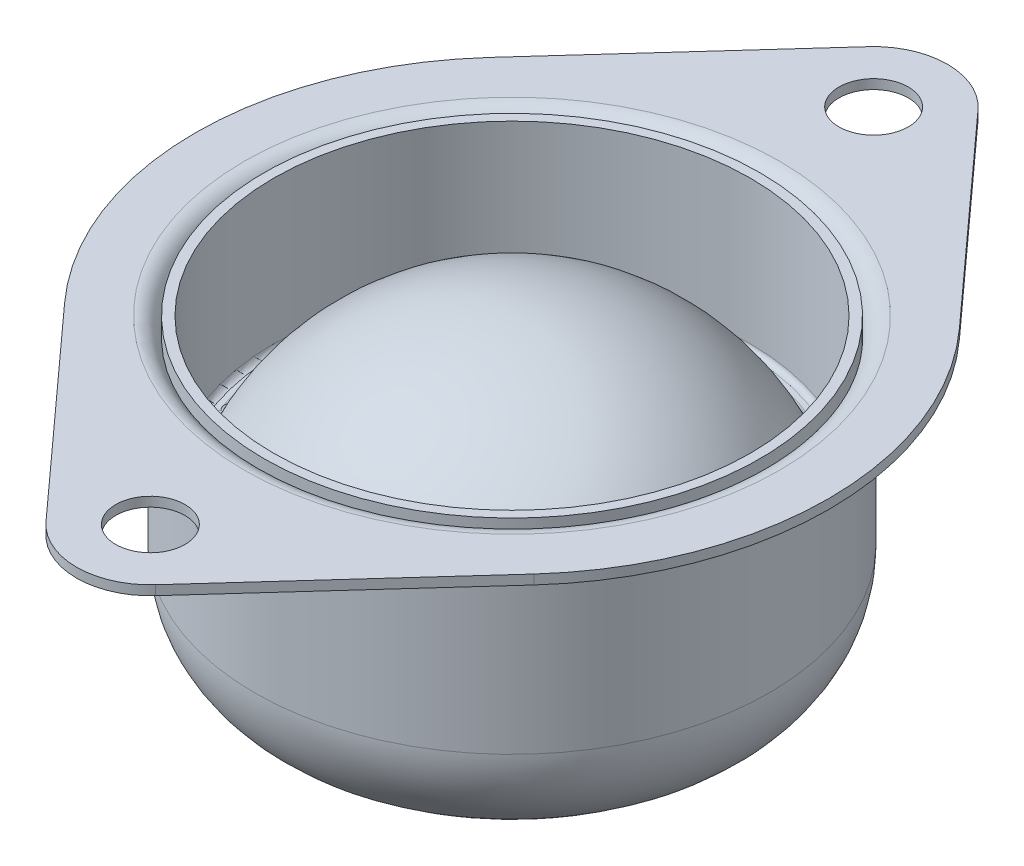
ISO-10303-21;
HEADER;
FILE_DESCRIPTION(('STEP AP214'),'2;1');
FILE_NAME('part.step','',(''),(''),'','','');
FILE_SCHEMA(('AUTOMOTIVE_DESIGN { 1 0 10303 214 1 1 1 1 }'));
ENDSEC;
DATA;
#1=APPLICATION_CONTEXT('core data for automotive mechanical design processes');
#2=APPLICATION_PROTOCOL_DEFINITION('international standard','automotive_design',2000,#1);
#3=PRODUCT_CONTEXT('',#1,'mechanical');
#4=PRODUCT('Part','Part','',(#3));
#5=PRODUCT_RELATED_PRODUCT_CATEGORY('part','',(#4));
#6=PRODUCT_DEFINITION_FORMATION('','',#4);
#7=PRODUCT_DEFINITION_CONTEXT('part definition',#1,'design');
#8=PRODUCT_DEFINITION('design','',#6,#7);
#9=PRODUCT_DEFINITION_SHAPE('','',#8);
#10=(LENGTH_UNIT() NAMED_UNIT(*) SI_UNIT(.MILLI.,.METRE.));
#11=(NAMED_UNIT(*) PLANE_ANGLE_UNIT() SI_UNIT($,.RADIAN.));
#12=(NAMED_UNIT(*) SI_UNIT($,.STERADIAN.) SOLID_ANGLE_UNIT());
#13=UNCERTAINTY_MEASURE_WITH_UNIT(LENGTH_MEASURE(1.E-05),#10,'distance_accuracy_value','');
#14=(GEOMETRIC_REPRESENTATION_CONTEXT(3) GLOBAL_UNCERTAINTY_ASSIGNED_CONTEXT((#13)) GLOBAL_UNIT_ASSIGNED_CONTEXT((#10,
#11,#12)) REPRESENTATION_CONTEXT('',''));
#15=CARTESIAN_POINT('',(0.,0.,0.));
#16=DIRECTION('',(0.,0.,1.));
#17=DIRECTION('',(1.,0.,0.));
#18=AXIS2_PLACEMENT_3D('',#15,#16,#17);
#19=CARTESIAN_POINT('',(0.,-16.7005,0.));
#20=DIRECTION('',(0.,-1.,0.));
#21=DIRECTION('',(0.,0.,1.));
#22=AXIS2_PLACEMENT_3D('',#19,#20,#21);
#23=SPHERICAL_SURFACE('',#22,12.7);
#24=CARTESIAN_POINT('',(0.,-29.4005,0.));
#25=VERTEX_POINT('',#24);
#26=VERTEX_LOOP('',#25);
#27=FACE_BOUND('',#26,.T.);
#28=ADVANCED_FACE('F46',(#27),#23,.T.);
#29=CLOSED_SHELL('',(#28));
#30=MANIFOLD_SOLID_BREP('B2',#29);
#31=CARTESIAN_POINT('',(0.,-11.938,0.));
#32=DIRECTION('',(0.,1.,0.));
#33=DIRECTION('',(0.,0.,1.));
#34=AXIS2_PLACEMENT_3D('',#31,#32,#33);
#35=CYLINDRICAL_SURFACE('',#34,19.8755);
#36=CARTESIAN_POINT('',(0.,-10.747375,0.));
#37=DIRECTION('',(0.,1.,0.));
#38=DIRECTION('',(0.,0.,1.));
#39=AXIS2_PLACEMENT_3D('',#36,#37,#38);
#40=CIRCLE('',#39,19.8755);
#41=CARTESIAN_POINT('',(0.,-10.747375,19.8755));
#42=VERTEX_POINT('',#41);
#43=EDGE_CURVE('E84',#42,#42,#40,.T.);
#44=ORIENTED_EDGE('',*,*,#43,.T.);
#45=EDGE_LOOP('',(#44));
#46=FACE_BOUND('',#45,.T.);
#47=CARTESIAN_POINT('',(0.,0.762,0.));
#48=DIRECTION('',(0.,1.,0.));
#49=DIRECTION('',(0.,0.,1.));
#50=AXIS2_PLACEMENT_3D('',#47,#48,#49);
#51=CIRCLE('',#50,19.8755);
#52=CARTESIAN_POINT('',(0.,0.762,19.8755));
#53=VERTEX_POINT('',#52);
#54=EDGE_CURVE('E89',#53,#53,#51,.T.);
#55=ORIENTED_EDGE('',*,*,#54,.F.);
#56=EDGE_LOOP('',(#55));
#57=FACE_BOUND('',#56,.T.);
#58=ADVANCED_FACE('F69',(#46,#57),#35,.T.);
#59=CARTESIAN_POINT('',(0.,-11.938,0.));
#60=DIRECTION('',(0.,1.,0.));
#61=DIRECTION('',(0.,0.,1.));
#62=AXIS2_PLACEMENT_3D('',#59,#60,#61);
#63=PLANE('',#62);
#64=CARTESIAN_POINT('',(0.,-11.938,0.));
#65=DIRECTION('',(0.,1.,0.));
#66=DIRECTION('',(0.,0.,1.));
#67=AXIS2_PLACEMENT_3D('',#64,#65,#66);
#68=CIRCLE('',#67,18.684875);
#69=CARTESIAN_POINT('',(0.,-11.938,18.684875));
#70=VERTEX_POINT('',#69);
#71=EDGE_CURVE('E76',#70,#70,#68,.F.);
#72=ORIENTED_EDGE('',*,*,#71,.T.);
#73=EDGE_LOOP('',(#72));
#74=FACE_BOUND('',#73,.T.);
#75=CARTESIAN_POINT('',(0.,-11.938,0.));
#76=DIRECTION('',(0.,1.,0.));
#77=DIRECTION('',(0.,0.,1.));
#78=AXIS2_PLACEMENT_3D('',#75,#76,#77);
#79=CIRCLE('',#78,18.2583205347589);
#80=CARTESIAN_POINT('',(0.,-11.938,18.2583205347589));
#81=VERTEX_POINT('',#80);
#82=EDGE_CURVE('E80',#81,#81,#79,.T.);
#83=ORIENTED_EDGE('',*,*,#82,.T.);
#84=EDGE_LOOP('',(#83));
#85=FACE_BOUND('',#84,.T.);
#86=ADVANCED_FACE('F121',(#74,#85),#63,.F.);
#87=CARTESIAN_POINT('',(0.,0.762,0.));
#88=DIRECTION('',(0.,1.,0.));
#89=DIRECTION('',(0.,0.,1.));
#90=AXIS2_PLACEMENT_3D('',#87,#88,#89);
#91=PLANE('',#90);
#92=CARTESIAN_POINT('',(0.,0.762000000000001,0.));
#93=DIRECTION('',(0.,1.,0.));
#94=DIRECTION('',(0.,0.,1.));
#95=AXIS2_PLACEMENT_3D('',#92,#93,#94);
#96=CIRCLE('',#95,19.1135);
#97=CARTESIAN_POINT('',(0.,0.762000000000001,19.1135));
#98=VERTEX_POINT('',#97);
#99=EDGE_CURVE('E93',#98,#98,#96,.T.);
#100=ORIENTED_EDGE('',*,*,#99,.F.);
#101=EDGE_LOOP('',(#100));
#102=FACE_BOUND('',#101,.T.);
#103=ORIENTED_EDGE('',*,*,#54,.T.);
#104=EDGE_LOOP('',(#103));
#105=FACE_BOUND('',#104,.T.);
#106=ADVANCED_FACE('F117',(#102,#105),#91,.T.);
#107=CARTESIAN_POINT('',(0.,-18.7407752659574,0.));
#108=DIRECTION('',(0.,-1.,0.));
#109=DIRECTION('',(0.,0.,1.));
#110=AXIS2_PLACEMENT_3D('',#107,#108,#109);
#111=SPHERICAL_SURFACE('',#110,18.7407752659574);
#112=CARTESIAN_POINT('',(0.,-11.2248699107771,0.));
#113=DIRECTION('',(0.,-1.,0.));
#114=DIRECTION('',(0.,0.,-1.));
#115=AXIS2_PLACEMENT_3D('',#112,#113,#114);
#116=CIRCLE('',#115,17.1676388668067);
#117=CARTESIAN_POINT('',(0.,-11.2248699107771,-17.1676388668067));
#118=VERTEX_POINT('',#117);
#119=EDGE_CURVE('E45',#118,#118,#116,.T.);
#120=ORIENTED_EDGE('',*,*,#119,.T.);
#121=EDGE_LOOP('',(#120));
#122=FACE_BOUND('',#121,.T.);
#123=ADVANCED_FACE('F120',(#122),#111,.F.);
#124=CARTESIAN_POINT('',(0.,-10.747375,0.));
#125=DIRECTION('',(0.,1.,0.));
#126=DIRECTION('',(0.,0.,1.));
#127=AXIS2_PLACEMENT_3D('',#124,#125,#126);
#128=TOROIDAL_SURFACE('',#127,18.684875,1.190625);
#129=ORIENTED_EDGE('',*,*,#71,.F.);
#130=EDGE_LOOP('',(#129));
#131=FACE_BOUND('',#130,.T.);
#132=ORIENTED_EDGE('',*,*,#43,.F.);
#133=EDGE_LOOP('',(#132));
#134=FACE_BOUND('',#133,.T.);
#135=ADVANCED_FACE('F132',(#131,#134),#128,.T.);
#136=CARTESIAN_POINT('',(0.,-10.747375,0.));
#137=DIRECTION('',(0.,1.,0.));
#138=DIRECTION('',(0.,0.,1.));
#139=AXIS2_PLACEMENT_3D('',#136,#137,#138);
#140=TOROIDAL_SURFACE('',#139,18.2583205347589,1.190625);
#141=ORIENTED_EDGE('',*,*,#82,.F.);
#142=EDGE_LOOP('',(#141));
#143=FACE_BOUND('',#142,.T.);
#144=ORIENTED_EDGE('',*,*,#119,.F.);
#145=EDGE_LOOP('',(#144));
#146=FACE_BOUND('',#145,.T.);
#147=ADVANCED_FACE('F71',(#143,#146),#140,.T.);
#148=CARTESIAN_POINT('',(0.,-11.938,0.));
#149=DIRECTION('',(0.,1.,0.));
#150=DIRECTION('',(0.,0.,1.));
#151=AXIS2_PLACEMENT_3D('',#148,#149,#150);
#152=CYLINDRICAL_SURFACE('',#151,19.1135);
#153=CARTESIAN_POINT('',(0.,-10.747375,0.));
#154=DIRECTION('',(0.,1.,0.));
#155=DIRECTION('',(0.,0.,1.));
#156=AXIS2_PLACEMENT_3D('',#153,#154,#155);
#157=CIRCLE('',#156,19.1135);
#158=CARTESIAN_POINT('',(0.,-10.747375,19.1135));
#159=VERTEX_POINT('',#158);
#160=EDGE_CURVE('E96',#159,#159,#157,.T.);
#161=ORIENTED_EDGE('',*,*,#160,.F.);
#162=EDGE_LOOP('',(#161));
#163=FACE_BOUND('',#162,.T.);
#164=ORIENTED_EDGE('',*,*,#99,.T.);
#165=EDGE_LOOP('',(#164));
#166=FACE_BOUND('',#165,.T.);
#167=ADVANCED_FACE('F110',(#163,#166),#152,.F.);
#168=CARTESIAN_POINT('',(0.,-11.176,0.));
#169=DIRECTION('',(0.,1.,0.));
#170=DIRECTION('',(0.,0.,1.));
#171=AXIS2_PLACEMENT_3D('',#168,#169,#170);
#172=PLANE('',#171);
#173=CARTESIAN_POINT('',(0.,-11.176,0.));
#174=DIRECTION('',(0.,1.,0.));
#175=DIRECTION('',(0.,0.,1.));
#176=AXIS2_PLACEMENT_3D('',#173,#174,#175);
#177=CIRCLE('',#176,18.684875);
#178=CARTESIAN_POINT('',(0.,-11.176,18.684875));
#179=VERTEX_POINT('',#178);
#180=EDGE_CURVE('E99',#179,#179,#177,.F.);
#181=ORIENTED_EDGE('',*,*,#180,.F.);
#182=EDGE_LOOP('',(#181));
#183=FACE_BOUND('',#182,.T.);
#184=CARTESIAN_POINT('',(0.,-11.176,0.));
#185=DIRECTION('',(0.,1.,0.));
#186=DIRECTION('',(0.,0.,1.));
#187=AXIS2_PLACEMENT_3D('',#184,#185,#186);
#188=CIRCLE('',#187,18.2583205347589);
#189=CARTESIAN_POINT('',(0.,-11.176,18.2583205347589));
#190=VERTEX_POINT('',#189);
#191=EDGE_CURVE('E100',#190,#190,#188,.T.);
#192=ORIENTED_EDGE('',*,*,#191,.F.);
#193=EDGE_LOOP('',(#192));
#194=FACE_BOUND('',#193,.T.);
#195=ADVANCED_FACE('F113',(#183,#194),#172,.T.);
#196=CARTESIAN_POINT('',(0.,-18.7407752659574,0.));
#197=DIRECTION('',(0.,-1.,0.));
#198=DIRECTION('',(0.,0.,1.));
#199=AXIS2_PLACEMENT_3D('',#196,#197,#198);
#200=SPHERICAL_SURFACE('',#199,19.5027752659574);
#201=CARTESIAN_POINT('',(0.,-10.9192731678797,0.));
#202=DIRECTION('',(0.,-1.,0.));
#203=DIRECTION('',(0.,0.,-1.));
#204=AXIS2_PLACEMENT_3D('',#201,#202,#203);
#205=CIRCLE('',#204,17.8656751342961);
#206=CARTESIAN_POINT('',(0.,-10.9192731678797,-17.8656751342961));
#207=VERTEX_POINT('',#206);
#208=EDGE_CURVE('E92',#207,#207,#205,.T.);
#209=ORIENTED_EDGE('',*,*,#208,.F.);
#210=EDGE_LOOP('',(#209));
#211=FACE_BOUND('',#210,.T.);
#212=ADVANCED_FACE('F152',(#211),#200,.T.);
#213=CARTESIAN_POINT('',(0.,-10.747375,0.));
#214=DIRECTION('',(0.,1.,0.));
#215=DIRECTION('',(0.,0.,1.));
#216=AXIS2_PLACEMENT_3D('',#213,#214,#215);
#217=TOROIDAL_SURFACE('',#216,18.684875,0.428625);
#218=ORIENTED_EDGE('',*,*,#180,.T.);
#219=EDGE_LOOP('',(#218));
#220=FACE_BOUND('',#219,.T.);
#221=ORIENTED_EDGE('',*,*,#160,.T.);
#222=EDGE_LOOP('',(#221));
#223=FACE_BOUND('',#222,.T.);
#224=ADVANCED_FACE('F108',(#220,#223),#217,.F.);
#225=CARTESIAN_POINT('',(0.,-10.747375,0.));
#226=DIRECTION('',(0.,1.,0.));
#227=DIRECTION('',(0.,0.,1.));
#228=AXIS2_PLACEMENT_3D('',#225,#226,#227);
#229=TOROIDAL_SURFACE('',#228,18.2583205347589,0.428625);
#230=ORIENTED_EDGE('',*,*,#191,.T.);
#231=EDGE_LOOP('',(#230));
#232=FACE_BOUND('',#231,.T.);
#233=ORIENTED_EDGE('',*,*,#208,.T.);
#234=EDGE_LOOP('',(#233));
#235=FACE_BOUND('',#234,.T.);
#236=ADVANCED_FACE('F146',(#232,#235),#229,.F.);
#237=CLOSED_SHELL('',(#58,#86,#106,#123,#135,#147,#167,#195,#212,#224,#236));
#238=MANIFOLD_SOLID_BREP('B6',#237);
#239=CARTESIAN_POINT('',(0.,0.762,0.));
#240=DIRECTION('',(0.,1.,0.));
#241=DIRECTION('',(0.,0.,1.));
#242=AXIS2_PLACEMENT_3D('',#239,#240,#241);
#243=PLANE('',#242);
#244=CARTESIAN_POINT('',(0.,0.762,0.));
#245=DIRECTION('',(0.,1.,0.));
#246=DIRECTION('',(0.,0.,1.));
#247=AXIS2_PLACEMENT_3D('',#244,#245,#246);
#248=CIRCLE('',#247,21.463);
#249=CARTESIAN_POINT('',(0.,0.762,21.463));
#250=VERTEX_POINT('',#249);
#251=EDGE_CURVE('E240',#250,#250,#248,.F.);
#252=ORIENTED_EDGE('',*,*,#251,.T.);
#253=EDGE_LOOP('',(#252));
#254=FACE_BOUND('',#253,.T.);
#255=CARTESIAN_POINT('',(0.,0.762,-29.));
#256=DIRECTION('',(0.,1.,0.));
#257=DIRECTION('',(0.,0.,1.));
#258=AXIS2_PLACEMENT_3D('',#255,#256,#257);
#259=CIRCLE('',#258,2.778125);
#260=CARTESIAN_POINT('',(0.,0.762,-31.778125));
#261=VERTEX_POINT('',#260);
#262=EDGE_CURVE('E333',#261,#261,#259,.T.);
#263=ORIENTED_EDGE('',*,*,#262,.F.);
#264=EDGE_LOOP('',(#263));
#265=FACE_BOUND('',#264,.T.);
#266=CARTESIAN_POINT('',(0.,0.762,0.));
#267=DIRECTION('',(0.,1.,0.));
#268=DIRECTION('',(0.,0.,1.));
#269=AXIS2_PLACEMENT_3D('',#266,#267,#268);
#270=CIRCLE('',#269,25.4);
#271=CARTESIAN_POINT('',(18.8203250421146,0.762,17.0574137931034));
#272=VERTEX_POINT('',#271);
#273=CARTESIAN_POINT('',(18.8203250421146,0.762,-17.0574137931035));
#274=VERTEX_POINT('',#273);
#275=EDGE_CURVE('E344',#272,#274,#270,.T.);
#276=ORIENTED_EDGE('',*,*,#275,.T.);
#277=DIRECTION('',(-0.671551724137932,0.,-0.740957678823407));
#278=VECTOR('',#277,1.);
#279=CARTESIAN_POINT('',(18.8203250421146,0.762,-17.0574137931035));
#280=LINE('',#279,#278);
#281=CARTESIAN_POINT('',(4.39017424702869,0.762,-32.9789439655172));
#282=VERTEX_POINT('',#281);
#283=EDGE_CURVE('E292',#274,#282,#280,.T.);
#284=ORIENTED_EDGE('',*,*,#283,.T.);
#285=CARTESIAN_POINT('',(0.,0.762,-29.));
#286=DIRECTION('',(0.,1.,0.));
#287=DIRECTION('',(0.,0.,1.));
#288=AXIS2_PLACEMENT_3D('',#285,#286,#287);
#289=CIRCLE('',#288,5.92499999999999);
#290=CARTESIAN_POINT('',(-4.39017424702868,0.762,-32.9789439655172));
#291=VERTEX_POINT('',#290);
#292=EDGE_CURVE('E464',#282,#291,#289,.T.);
#293=ORIENTED_EDGE('',*,*,#292,.T.);
#294=DIRECTION('',(-0.671551724137931,0.,0.740957678823408));
#295=VECTOR('',#294,1.);
#296=CARTESIAN_POINT('',(-4.39017424702868,0.762,-32.9789439655172));
#297=LINE('',#296,#295);
#298=CARTESIAN_POINT('',(-18.8203250421145,0.762,-17.0574137931034));
#299=VERTEX_POINT('',#298);
#300=EDGE_CURVE('E466',#291,#299,#297,.T.);
#301=ORIENTED_EDGE('',*,*,#300,.T.);
#302=CARTESIAN_POINT('',(0.,0.762,0.));
#303=DIRECTION('',(0.,1.,0.));
#304=DIRECTION('',(0.,0.,1.));
#305=AXIS2_PLACEMENT_3D('',#302,#303,#304);
#306=CIRCLE('',#305,25.4);
#307=CARTESIAN_POINT('',(-18.8203250421145,0.762,17.0574137931034));
#308=VERTEX_POINT('',#307);
#309=EDGE_CURVE('E311',#299,#308,#306,.T.);
#310=ORIENTED_EDGE('',*,*,#309,.T.);
#311=DIRECTION('',(0.671551724137931,0.,0.740957678823408));
#312=VECTOR('',#311,1.);
#313=CARTESIAN_POINT('',(-4.39017424702868,0.762,32.9789439655172));
#314=LINE('',#313,#312);
#315=CARTESIAN_POINT('',(-4.39017424702868,0.762,32.9789439655172));
#316=VERTEX_POINT('',#315);
#317=EDGE_CURVE('E305',#308,#316,#314,.T.);
#318=ORIENTED_EDGE('',*,*,#317,.T.);
#319=CARTESIAN_POINT('',(0.,0.762,29.));
#320=DIRECTION('',(0.,1.,0.));
#321=DIRECTION('',(0.,0.,1.));
#322=AXIS2_PLACEMENT_3D('',#319,#320,#321);
#323=CIRCLE('',#322,5.92499999999999);
#324=CARTESIAN_POINT('',(4.39017424702869,0.762,32.9789439655172));
#325=VERTEX_POINT('',#324);
#326=EDGE_CURVE('E309',#316,#325,#323,.T.);
#327=ORIENTED_EDGE('',*,*,#326,.T.);
#328=DIRECTION('',(0.671551724137931,0.,-0.740957678823407));
#329=VECTOR('',#328,1.);
#330=CARTESIAN_POINT('',(18.8203250421146,0.762,17.0574137931034));
#331=LINE('',#330,#329);
#332=EDGE_CURVE('E248',#325,#272,#331,.T.);
#333=ORIENTED_EDGE('',*,*,#332,.T.);
#334=EDGE_LOOP('',(#276,#284,#293,#301,#310,#318,#327,#333));
#335=FACE_BOUND('',#334,.T.);
#336=CARTESIAN_POINT('',(0.,0.762,29.));
#337=DIRECTION('',(0.,1.,0.));
#338=DIRECTION('',(0.,0.,1.));
#339=AXIS2_PLACEMENT_3D('',#336,#337,#338);
#340=CIRCLE('',#339,2.778125);
#341=CARTESIAN_POINT('',(0.,0.762,26.221875));
#342=VERTEX_POINT('',#341);
#343=EDGE_CURVE('E452',#342,#342,#340,.T.);
#344=ORIENTED_EDGE('',*,*,#343,.F.);
#345=EDGE_LOOP('',(#344));
#346=FACE_BOUND('',#345,.T.);
#347=ADVANCED_FACE('F231',(#254,#265,#335,#346),#243,.T.);
#348=CARTESIAN_POINT('',(0.,0.,0.));
#349=DIRECTION('',(0.,1.,0.));
#350=DIRECTION('',(0.,0.,1.));
#351=AXIS2_PLACEMENT_3D('',#348,#349,#350);
#352=PLANE('',#351);
#353=CARTESIAN_POINT('',(0.,0.,0.));
#354=DIRECTION('',(0.,1.,0.));
#355=DIRECTION('',(0.,0.,1.));
#356=AXIS2_PLACEMENT_3D('',#353,#354,#355);
#357=CIRCLE('',#356,22.225);
#358=CARTESIAN_POINT('',(0.,0.,22.225));
#359=VERTEX_POINT('',#358);
#360=EDGE_CURVE('E365',#359,#359,#357,.T.);
#361=ORIENTED_EDGE('',*,*,#360,.T.);
#362=EDGE_LOOP('',(#361));
#363=FACE_BOUND('',#362,.T.);
#364=CARTESIAN_POINT('',(0.,0.,0.));
#365=DIRECTION('',(0.,1.,0.));
#366=DIRECTION('',(0.,0.,1.));
#367=AXIS2_PLACEMENT_3D('',#364,#365,#366);
#368=CIRCLE('',#367,25.4);
#369=CARTESIAN_POINT('',(18.8203250421146,0.,17.0574137931034));
#370=VERTEX_POINT('',#369);
#371=CARTESIAN_POINT('',(18.8203250421146,0.,-17.0574137931035));
#372=VERTEX_POINT('',#371);
#373=EDGE_CURVE('E329',#370,#372,#368,.T.);
#374=ORIENTED_EDGE('',*,*,#373,.F.);
#375=DIRECTION('',(0.671551724137931,0.,-0.740957678823407));
#376=VECTOR('',#375,1.);
#377=CARTESIAN_POINT('',(18.8203250421146,0.,17.0574137931034));
#378=LINE('',#377,#376);
#379=CARTESIAN_POINT('',(4.39017424702869,0.,32.9789439655172));
#380=VERTEX_POINT('',#379);
#381=EDGE_CURVE('E283',#380,#370,#378,.T.);
#382=ORIENTED_EDGE('',*,*,#381,.F.);
#383=CARTESIAN_POINT('',(0.,0.,29.));
#384=DIRECTION('',(0.,1.,0.));
#385=DIRECTION('',(0.,0.,1.));
#386=AXIS2_PLACEMENT_3D('',#383,#384,#385);
#387=CIRCLE('',#386,5.92499999999999);
#388=CARTESIAN_POINT('',(-4.39017424702868,0.,32.9789439655172));
#389=VERTEX_POINT('',#388);
#390=EDGE_CURVE('E277',#389,#380,#387,.T.);
#391=ORIENTED_EDGE('',*,*,#390,.F.);
#392=DIRECTION('',(0.671551724137931,0.,0.740957678823408));
#393=VECTOR('',#392,1.);
#394=CARTESIAN_POINT('',(-4.39017424702868,0.,32.9789439655172));
#395=LINE('',#394,#393);
#396=CARTESIAN_POINT('',(-18.8203250421145,0.,17.0574137931034));
#397=VERTEX_POINT('',#396);
#398=EDGE_CURVE('E319',#397,#389,#395,.T.);
#399=ORIENTED_EDGE('',*,*,#398,.F.);
#400=CARTESIAN_POINT('',(0.,0.,0.));
#401=DIRECTION('',(0.,1.,0.));
#402=DIRECTION('',(0.,0.,1.));
#403=AXIS2_PLACEMENT_3D('',#400,#401,#402);
#404=CIRCLE('',#403,25.4);
#405=CARTESIAN_POINT('',(-18.8203250421145,0.,-17.0574137931034));
#406=VERTEX_POINT('',#405);
#407=EDGE_CURVE('E339',#406,#397,#404,.T.);
#408=ORIENTED_EDGE('',*,*,#407,.F.);
#409=DIRECTION('',(-0.671551724137931,0.,0.740957678823408));
#410=VECTOR('',#409,1.);
#411=CARTESIAN_POINT('',(-4.39017424702868,0.,-32.9789439655172));
#412=LINE('',#411,#410);
#413=CARTESIAN_POINT('',(-4.39017424702868,0.,-32.9789439655172));
#414=VERTEX_POINT('',#413);
#415=EDGE_CURVE('E337',#414,#406,#412,.T.);
#416=ORIENTED_EDGE('',*,*,#415,.F.);
#417=CARTESIAN_POINT('',(0.,0.,-29.));
#418=DIRECTION('',(0.,1.,0.));
#419=DIRECTION('',(0.,0.,1.));
#420=AXIS2_PLACEMENT_3D('',#417,#418,#419);
#421=CIRCLE('',#420,5.92499999999999);
#422=CARTESIAN_POINT('',(4.39017424702869,0.,-32.9789439655172));
#423=VERTEX_POINT('',#422);
#424=EDGE_CURVE('E335',#423,#414,#421,.T.);
#425=ORIENTED_EDGE('',*,*,#424,.F.);
#426=DIRECTION('',(-0.671551724137932,0.,-0.740957678823407));
#427=VECTOR('',#426,1.);
#428=CARTESIAN_POINT('',(18.8203250421146,0.,-17.0574137931035));
#429=LINE('',#428,#427);
#430=EDGE_CURVE('E332',#372,#423,#429,.T.);
#431=ORIENTED_EDGE('',*,*,#430,.F.);
#432=EDGE_LOOP('',(#374,#382,#391,#399,#408,#416,#425,#431));
#433=FACE_BOUND('',#432,.T.);
#434=CARTESIAN_POINT('',(0.,0.,-29.));
#435=DIRECTION('',(0.,1.,0.));
#436=DIRECTION('',(0.,0.,1.));
#437=AXIS2_PLACEMENT_3D('',#434,#435,#436);
#438=CIRCLE('',#437,2.778125);
#439=CARTESIAN_POINT('',(0.,0.,-31.778125));
#440=VERTEX_POINT('',#439);
#441=EDGE_CURVE('E455',#440,#440,#438,.T.);
#442=ORIENTED_EDGE('',*,*,#441,.T.);
#443=EDGE_LOOP('',(#442));
#444=FACE_BOUND('',#443,.T.);
#445=CARTESIAN_POINT('',(0.,0.,29.));
#446=DIRECTION('',(0.,1.,0.));
#447=DIRECTION('',(0.,0.,1.));
#448=AXIS2_PLACEMENT_3D('',#445,#446,#447);
#449=CIRCLE('',#448,2.778125);
#450=CARTESIAN_POINT('',(0.,0.,26.221875));
#451=VERTEX_POINT('',#450);
#452=EDGE_CURVE('E451',#451,#451,#449,.T.);
#453=ORIENTED_EDGE('',*,*,#452,.T.);
#454=EDGE_LOOP('',(#453));
#455=FACE_BOUND('',#454,.T.);
#456=ADVANCED_FACE('F386',(#363,#433,#444,#455),#352,.F.);
#457=CARTESIAN_POINT('',(0.,0.762,0.));
#458=DIRECTION('',(0.,-1.,0.));
#459=DIRECTION('',(0.,0.,-1.));
#460=AXIS2_PLACEMENT_3D('',#457,#458,#459);
#461=CYLINDRICAL_SURFACE('',#460,25.4);
#462=ORIENTED_EDGE('',*,*,#373,.T.);
#463=DIRECTION('',(0.,-1.,0.));
#464=VECTOR('',#463,1.);
#465=CARTESIAN_POINT('',(18.8203250421146,0.762,-17.0574137931035));
#466=LINE('',#465,#464);
#467=EDGE_CURVE('E357',#274,#372,#466,.T.);
#468=ORIENTED_EDGE('',*,*,#467,.F.);
#469=ORIENTED_EDGE('',*,*,#275,.F.);
#470=DIRECTION('',(0.,-1.,0.));
#471=VECTOR('',#470,1.);
#472=CARTESIAN_POINT('',(18.8203250421146,0.762,17.0574137931034));
#473=LINE('',#472,#471);
#474=EDGE_CURVE('E325',#272,#370,#473,.T.);
#475=ORIENTED_EDGE('',*,*,#474,.T.);
#476=EDGE_LOOP('',(#462,#468,#469,#475));
#477=FACE_BOUND('',#476,.T.);
#478=ADVANCED_FACE('F391',(#477),#461,.T.);
#479=CARTESIAN_POINT('',(18.8203250421146,0.762,-17.0574137931035));
#480=DIRECTION('',(-0.740957678823407,0.,0.671551724137931));
#481=DIRECTION('',(0.671551724137932,0.,0.740957678823407));
#482=AXIS2_PLACEMENT_3D('',#479,#480,#481);
#483=PLANE('',#482);
#484=ORIENTED_EDGE('',*,*,#430,.T.);
#485=DIRECTION('',(0.,-1.,0.));
#486=VECTOR('',#485,1.);
#487=CARTESIAN_POINT('',(4.39017424702869,0.762,-32.9789439655172));
#488=LINE('',#487,#486);
#489=EDGE_CURVE('E354',#282,#423,#488,.T.);
#490=ORIENTED_EDGE('',*,*,#489,.F.);
#491=ORIENTED_EDGE('',*,*,#283,.F.);
#492=ORIENTED_EDGE('',*,*,#467,.T.);
#493=EDGE_LOOP('',(#484,#490,#491,#492));
#494=FACE_BOUND('',#493,.T.);
#495=ADVANCED_FACE('F416',(#494),#483,.F.);
#496=CARTESIAN_POINT('',(0.,0.762,-29.));
#497=DIRECTION('',(0.,-1.,0.));
#498=DIRECTION('',(0.,0.,-1.));
#499=AXIS2_PLACEMENT_3D('',#496,#497,#498);
#500=CYLINDRICAL_SURFACE('',#499,5.92499999999999);
#501=ORIENTED_EDGE('',*,*,#424,.T.);
#502=DIRECTION('',(0.,-1.,0.));
#503=VECTOR('',#502,1.);
#504=CARTESIAN_POINT('',(-4.39017424702868,0.762,-32.9789439655172));
#505=LINE('',#504,#503);
#506=EDGE_CURVE('E351',#291,#414,#505,.T.);
#507=ORIENTED_EDGE('',*,*,#506,.F.);
#508=ORIENTED_EDGE('',*,*,#292,.F.);
#509=ORIENTED_EDGE('',*,*,#489,.T.);
#510=EDGE_LOOP('',(#501,#507,#508,#509));
#511=FACE_BOUND('',#510,.T.);
#512=ADVANCED_FACE('F412',(#511),#500,.T.);
#513=CARTESIAN_POINT('',(-4.39017424702868,0.762,-32.9789439655172));
#514=DIRECTION('',(0.740957678823408,0.,0.671551724137931));
#515=DIRECTION('',(0.671551724137931,0.,-0.740957678823408));
#516=AXIS2_PLACEMENT_3D('',#513,#514,#515);
#517=PLANE('',#516);
#518=ORIENTED_EDGE('',*,*,#415,.T.);
#519=DIRECTION('',(0.,-1.,0.));
#520=VECTOR('',#519,1.);
#521=CARTESIAN_POINT('',(-18.8203250421145,0.762,-17.0574137931034));
#522=LINE('',#521,#520);
#523=EDGE_CURVE('E348',#299,#406,#522,.T.);
#524=ORIENTED_EDGE('',*,*,#523,.F.);
#525=ORIENTED_EDGE('',*,*,#300,.F.);
#526=ORIENTED_EDGE('',*,*,#506,.T.);
#527=EDGE_LOOP('',(#518,#524,#525,#526));
#528=FACE_BOUND('',#527,.T.);
#529=ADVANCED_FACE('F408',(#528),#517,.F.);
#530=CARTESIAN_POINT('',(0.,0.762,0.));
#531=DIRECTION('',(0.,-1.,0.));
#532=DIRECTION('',(0.,0.,-1.));
#533=AXIS2_PLACEMENT_3D('',#530,#531,#532);
#534=CYLINDRICAL_SURFACE('',#533,25.4);
#535=ORIENTED_EDGE('',*,*,#407,.T.);
#536=DIRECTION('',(0.,-1.,0.));
#537=VECTOR('',#536,1.);
#538=CARTESIAN_POINT('',(-18.8203250421145,0.762,17.0574137931034));
#539=LINE('',#538,#537);
#540=EDGE_CURVE('E320',#308,#397,#539,.T.);
#541=ORIENTED_EDGE('',*,*,#540,.F.);
#542=ORIENTED_EDGE('',*,*,#309,.F.);
#543=ORIENTED_EDGE('',*,*,#523,.T.);
#544=EDGE_LOOP('',(#535,#541,#542,#543));
#545=FACE_BOUND('',#544,.T.);
#546=ADVANCED_FACE('F405',(#545),#534,.T.);
#547=CARTESIAN_POINT('',(-4.39017424702868,0.762,32.9789439655172));
#548=DIRECTION('',(0.740957678823407,0.,-0.671551724137931));
#549=DIRECTION('',(-0.671551724137931,0.,-0.740957678823408));
#550=AXIS2_PLACEMENT_3D('',#547,#548,#549);
#551=PLANE('',#550);
#552=ORIENTED_EDGE('',*,*,#398,.T.);
#553=DIRECTION('',(0.,-1.,0.));
#554=VECTOR('',#553,1.);
#555=CARTESIAN_POINT('',(-4.39017424702868,0.762,32.9789439655172));
#556=LINE('',#555,#554);
#557=EDGE_CURVE('E316',#316,#389,#556,.T.);
#558=ORIENTED_EDGE('',*,*,#557,.F.);
#559=ORIENTED_EDGE('',*,*,#317,.F.);
#560=ORIENTED_EDGE('',*,*,#540,.T.);
#561=EDGE_LOOP('',(#552,#558,#559,#560));
#562=FACE_BOUND('',#561,.T.);
#563=ADVANCED_FACE('F317',(#562),#551,.F.);
#564=CARTESIAN_POINT('',(0.,0.762,29.));
#565=DIRECTION('',(0.,-1.,0.));
#566=DIRECTION('',(0.,0.,-1.));
#567=AXIS2_PLACEMENT_3D('',#564,#565,#566);
#568=CYLINDRICAL_SURFACE('',#567,5.92499999999999);
#569=ORIENTED_EDGE('',*,*,#390,.T.);
#570=DIRECTION('',(0.,-1.,0.));
#571=VECTOR('',#570,1.);
#572=CARTESIAN_POINT('',(4.39017424702869,0.762,32.9789439655172));
#573=LINE('',#572,#571);
#574=EDGE_CURVE('E321',#325,#380,#573,.T.);
#575=ORIENTED_EDGE('',*,*,#574,.F.);
#576=ORIENTED_EDGE('',*,*,#326,.F.);
#577=ORIENTED_EDGE('',*,*,#557,.T.);
#578=EDGE_LOOP('',(#569,#575,#576,#577));
#579=FACE_BOUND('',#578,.T.);
#580=ADVANCED_FACE('F323',(#579),#568,.T.);
#581=CARTESIAN_POINT('',(18.8203250421146,0.762,17.0574137931034));
#582=DIRECTION('',(-0.740957678823407,0.,-0.671551724137931));
#583=DIRECTION('',(-0.671551724137931,0.,0.740957678823407));
#584=AXIS2_PLACEMENT_3D('',#581,#582,#583);
#585=PLANE('',#584);
#586=ORIENTED_EDGE('',*,*,#381,.T.);
#587=ORIENTED_EDGE('',*,*,#474,.F.);
#588=ORIENTED_EDGE('',*,*,#332,.F.);
#589=ORIENTED_EDGE('',*,*,#574,.T.);
#590=EDGE_LOOP('',(#586,#587,#588,#589));
#591=FACE_BOUND('',#590,.T.);
#592=ADVANCED_FACE('F398',(#591),#585,.F.);
#593=CARTESIAN_POINT('',(0.,0.762,-29.));
#594=DIRECTION('',(0.,-1.,0.));
#595=DIRECTION('',(0.,0.,-1.));
#596=AXIS2_PLACEMENT_3D('',#593,#594,#595);
#597=CYLINDRICAL_SURFACE('',#596,2.778125);
#598=CARTESIAN_POINT('',(0.,0.762,-31.778125));
#599=CARTESIAN_POINT('',(0.,0.7540625,-31.778125));
#600=CARTESIAN_POINT('',(0.,0.746125,-31.778125));
#601=CARTESIAN_POINT('',(0.,0.73025,-31.778125));
#602=CARTESIAN_POINT('',(0.,0.7223125,-31.778125));
#603=CARTESIAN_POINT('',(0.,0.7064375,-31.778125));
#604=CARTESIAN_POINT('',(0.,0.6985,-31.778125));
#605=CARTESIAN_POINT('',(0.,0.682625,-31.778125));
#606=CARTESIAN_POINT('',(0.,0.6746875,-31.778125));
#607=CARTESIAN_POINT('',(0.,0.6588125,-31.778125));
#608=CARTESIAN_POINT('',(0.,0.650875,-31.778125));
#609=CARTESIAN_POINT('',(0.,0.635,-31.778125));
#610=CARTESIAN_POINT('',(0.,0.6270625,-31.778125));
#611=CARTESIAN_POINT('',(0.,0.6111875,-31.778125));
#612=CARTESIAN_POINT('',(0.,0.60325,-31.778125));
#613=CARTESIAN_POINT('',(0.,0.587375,-31.778125));
#614=CARTESIAN_POINT('',(0.,0.5794375,-31.778125));
#615=CARTESIAN_POINT('',(0.,0.5635625,-31.778125));
#616=CARTESIAN_POINT('',(0.,0.555625,-31.778125));
#617=CARTESIAN_POINT('',(0.,0.53975,-31.778125));
#618=CARTESIAN_POINT('',(0.,0.5318125,-31.778125));
#619=CARTESIAN_POINT('',(0.,0.5159375,-31.778125));
#620=CARTESIAN_POINT('',(0.,0.508,-31.778125));
#621=CARTESIAN_POINT('',(0.,0.492125,-31.778125));
#622=CARTESIAN_POINT('',(0.,0.4841875,-31.778125));
#623=CARTESIAN_POINT('',(0.,0.4683125,-31.778125));
#624=CARTESIAN_POINT('',(0.,0.460375,-31.778125));
#625=CARTESIAN_POINT('',(0.,0.4445,-31.778125));
#626=CARTESIAN_POINT('',(0.,0.4365625,-31.778125));
#627=CARTESIAN_POINT('',(0.,0.4206875,-31.778125));
#628=CARTESIAN_POINT('',(0.,0.41275,-31.778125));
#629=CARTESIAN_POINT('',(0.,0.396875,-31.778125));
#630=CARTESIAN_POINT('',(0.,0.3889375,-31.778125));
#631=CARTESIAN_POINT('',(0.,0.3730625,-31.778125));
#632=CARTESIAN_POINT('',(0.,0.365125,-31.778125));
#633=CARTESIAN_POINT('',(0.,0.34925,-31.778125));
#634=CARTESIAN_POINT('',(0.,0.3413125,-31.778125));
#635=CARTESIAN_POINT('',(0.,0.3254375,-31.778125));
#636=CARTESIAN_POINT('',(0.,0.3175,-31.778125));
#637=CARTESIAN_POINT('',(0.,0.301625,-31.778125));
#638=CARTESIAN_POINT('',(0.,0.2936875,-31.778125));
#639=CARTESIAN_POINT('',(0.,0.2778125,-31.778125));
#640=CARTESIAN_POINT('',(0.,0.269875,-31.778125));
#641=CARTESIAN_POINT('',(0.,0.254,-31.778125));
#642=CARTESIAN_POINT('',(0.,0.2460625,-31.778125));
#643=CARTESIAN_POINT('',(0.,0.2301875,-31.778125));
#644=CARTESIAN_POINT('',(0.,0.22225,-31.778125));
#645=CARTESIAN_POINT('',(0.,0.206375,-31.778125));
#646=CARTESIAN_POINT('',(0.,0.1984375,-31.778125));
#647=CARTESIAN_POINT('',(0.,0.1825625,-31.778125));
#648=CARTESIAN_POINT('',(0.,0.174625,-31.778125));
#649=CARTESIAN_POINT('',(0.,0.15875,-31.778125));
#650=CARTESIAN_POINT('',(0.,0.1508125,-31.778125));
#651=CARTESIAN_POINT('',(0.,0.1349375,-31.778125));
#652=CARTESIAN_POINT('',(0.,0.127,-31.778125));
#653=CARTESIAN_POINT('',(0.,0.111125,-31.778125));
#654=CARTESIAN_POINT('',(0.,0.1031875,-31.778125));
#655=CARTESIAN_POINT('',(0.,0.0873125,-31.778125));
#656=CARTESIAN_POINT('',(0.,0.079375,-31.778125));
#657=CARTESIAN_POINT('',(0.,0.0635,-31.778125));
#658=CARTESIAN_POINT('',(0.,0.0555625,-31.778125));
#659=CARTESIAN_POINT('',(0.,0.0396875,-31.778125));
#660=CARTESIAN_POINT('',(0.,0.03175,-31.778125));
#661=CARTESIAN_POINT('',(0.,0.015875,-31.778125));
#662=CARTESIAN_POINT('',(0.,0.00793749999999999,-31.778125));
#663=CARTESIAN_POINT('',(0.,0.,-31.778125));
#664=B_SPLINE_CURVE_WITH_KNOTS('',3,(#598,#599,#600,#601,#602,#603,#604,#605,#606,#607,#608,
#609,#610,#611,#612,#613,#614,#615,#616,#617,#618,#619,#620,#621,#622,#623,#624,#625,#626,#627,
#628,#629,#630,#631,#632,#633,#634,#635,#636,#637,#638,#639,#640,#641,#642,#643,#644,#645,#646,
#647,#648,#649,#650,#651,#652,#653,#654,#655,#656,#657,#658,#659,#660,#661,#662,#663),
.UNSPECIFIED.,.F.,.F.,(4,2,2,2,2,2,2,2,2,2,2,2,2,2,2,2,2,2,2,2,2,2,2,2,2,2,2,2,2,2,2,2,4),(0.,
0.0238125,0.0476249999999999,0.0714374999999999,0.09525,0.1190625,0.142875,0.1666875,0.1905,
0.2143125,0.238125,0.2619375,0.28575,0.3095625,0.333375,0.3571875,0.381,0.4048125,0.428625,
0.4524375,0.47625,0.5000625,0.523875,0.5476875,0.5715,0.5953125,0.619125,0.6429375,0.66675,
0.6905625,0.714375,0.7381875,0.762),.UNSPECIFIED.);
#665=EDGE_CURVE('BSEAM395',#261,#440,#664,.T.);
#666=ORIENTED_EDGE('',*,*,#262,.T.);
#667=ORIENTED_EDGE('',*,*,#441,.F.);
#668=ORIENTED_EDGE('',*,*,#665,.T.);
#669=ORIENTED_EDGE('',*,*,#665,.F.);
#670=EDGE_LOOP('',(#666,#668,#667,#669));
#671=FACE_BOUND('',#670,.T.);
#672=ADVANCED_FACE('F395',(#671),#597,.F.);
#673=CARTESIAN_POINT('',(0.,0.762,29.));
#674=DIRECTION('',(0.,-1.,0.));
#675=DIRECTION('',(0.,0.,-1.));
#676=AXIS2_PLACEMENT_3D('',#673,#674,#675);
#677=CYLINDRICAL_SURFACE('',#676,2.778125);
#678=CARTESIAN_POINT('',(0.,0.762,26.221875));
#679=CARTESIAN_POINT('',(0.,0.7540625,26.221875));
#680=CARTESIAN_POINT('',(0.,0.746125,26.221875));
#681=CARTESIAN_POINT('',(0.,0.73025,26.221875));
#682=CARTESIAN_POINT('',(0.,0.7223125,26.221875));
#683=CARTESIAN_POINT('',(0.,0.7064375,26.221875));
#684=CARTESIAN_POINT('',(0.,0.6985,26.221875));
#685=CARTESIAN_POINT('',(0.,0.682625,26.221875));
#686=CARTESIAN_POINT('',(0.,0.6746875,26.221875));
#687=CARTESIAN_POINT('',(0.,0.6588125,26.221875));
#688=CARTESIAN_POINT('',(0.,0.650875,26.221875));
#689=CARTESIAN_POINT('',(0.,0.635,26.221875));
#690=CARTESIAN_POINT('',(0.,0.6270625,26.221875));
#691=CARTESIAN_POINT('',(0.,0.6111875,26.221875));
#692=CARTESIAN_POINT('',(0.,0.60325,26.221875));
#693=CARTESIAN_POINT('',(0.,0.587375,26.221875));
#694=CARTESIAN_POINT('',(0.,0.5794375,26.221875));
#695=CARTESIAN_POINT('',(0.,0.5635625,26.221875));
#696=CARTESIAN_POINT('',(0.,0.555625,26.221875));
#697=CARTESIAN_POINT('',(0.,0.53975,26.221875));
#698=CARTESIAN_POINT('',(0.,0.5318125,26.221875));
#699=CARTESIAN_POINT('',(0.,0.5159375,26.221875));
#700=CARTESIAN_POINT('',(0.,0.508,26.221875));
#701=CARTESIAN_POINT('',(0.,0.492125,26.221875));
#702=CARTESIAN_POINT('',(0.,0.4841875,26.221875));
#703=CARTESIAN_POINT('',(0.,0.4683125,26.221875));
#704=CARTESIAN_POINT('',(0.,0.460375,26.221875));
#705=CARTESIAN_POINT('',(0.,0.4445,26.221875));
#706=CARTESIAN_POINT('',(0.,0.4365625,26.221875));
#707=CARTESIAN_POINT('',(0.,0.4206875,26.221875));
#708=CARTESIAN_POINT('',(0.,0.41275,26.221875));
#709=CARTESIAN_POINT('',(0.,0.396875,26.221875));
#710=CARTESIAN_POINT('',(0.,0.3889375,26.221875));
#711=CARTESIAN_POINT('',(0.,0.3730625,26.221875));
#712=CARTESIAN_POINT('',(0.,0.365125,26.221875));
#713=CARTESIAN_POINT('',(0.,0.34925,26.221875));
#714=CARTESIAN_POINT('',(0.,0.3413125,26.221875));
#715=CARTESIAN_POINT('',(0.,0.3254375,26.221875));
#716=CARTESIAN_POINT('',(0.,0.3175,26.221875));
#717=CARTESIAN_POINT('',(0.,0.301625,26.221875));
#718=CARTESIAN_POINT('',(0.,0.2936875,26.221875));
#719=CARTESIAN_POINT('',(0.,0.2778125,26.221875));
#720=CARTESIAN_POINT('',(0.,0.269875,26.221875));
#721=CARTESIAN_POINT('',(0.,0.254,26.221875));
#722=CARTESIAN_POINT('',(0.,0.2460625,26.221875));
#723=CARTESIAN_POINT('',(0.,0.2301875,26.221875));
#724=CARTESIAN_POINT('',(0.,0.22225,26.221875));
#725=CARTESIAN_POINT('',(0.,0.206375,26.221875));
#726=CARTESIAN_POINT('',(0.,0.1984375,26.221875));
#727=CARTESIAN_POINT('',(0.,0.1825625,26.221875));
#728=CARTESIAN_POINT('',(0.,0.174625,26.221875));
#729=CARTESIAN_POINT('',(0.,0.15875,26.221875));
#730=CARTESIAN_POINT('',(0.,0.1508125,26.221875));
#731=CARTESIAN_POINT('',(0.,0.1349375,26.221875));
#732=CARTESIAN_POINT('',(0.,0.127,26.221875));
#733=CARTESIAN_POINT('',(0.,0.111125,26.221875));
#734=CARTESIAN_POINT('',(0.,0.1031875,26.221875));
#735=CARTESIAN_POINT('',(0.,0.0873125,26.221875));
#736=CARTESIAN_POINT('',(0.,0.079375,26.221875));
#737=CARTESIAN_POINT('',(0.,0.0635,26.221875));
#738=CARTESIAN_POINT('',(0.,0.0555625,26.221875));
#739=CARTESIAN_POINT('',(0.,0.0396875,26.221875));
#740=CARTESIAN_POINT('',(0.,0.03175,26.221875));
#741=CARTESIAN_POINT('',(0.,0.015875,26.221875));
#742=CARTESIAN_POINT('',(0.,0.00793749999999999,26.221875));
#743=CARTESIAN_POINT('',(0.,0.,26.221875));
#744=B_SPLINE_CURVE_WITH_KNOTS('',3,(#678,#679,#680,#681,#682,#683,#684,#685,#686,#687,#688,
#689,#690,#691,#692,#693,#694,#695,#696,#697,#698,#699,#700,#701,#702,#703,#704,#705,#706,#707,
#708,#709,#710,#711,#712,#713,#714,#715,#716,#717,#718,#719,#720,#721,#722,#723,#724,#725,#726,
#727,#728,#729,#730,#731,#732,#733,#734,#735,#736,#737,#738,#739,#740,#741,#742,#743),
.UNSPECIFIED.,.F.,.F.,(4,2,2,2,2,2,2,2,2,2,2,2,2,2,2,2,2,2,2,2,2,2,2,2,2,2,2,2,2,2,2,2,4),(0.,
0.0238125,0.0476249999999999,0.0714374999999999,0.09525,0.1190625,0.142875,0.1666875,0.1905,
0.2143125,0.238125,0.2619375,0.28575,0.3095625,0.333375,0.3571875,0.381,0.4048125,0.428625,
0.4524375,0.47625,0.5000625,0.523875,0.5476875,0.5715,0.5953125,0.619125,0.6429375,0.66675,
0.6905625,0.714375,0.7381875,0.762),.UNSPECIFIED.);
#745=EDGE_CURVE('BSEAM434',#342,#451,#744,.T.);
#746=ORIENTED_EDGE('',*,*,#343,.T.);
#747=ORIENTED_EDGE('',*,*,#452,.F.);
#748=ORIENTED_EDGE('',*,*,#745,.T.);
#749=ORIENTED_EDGE('',*,*,#745,.F.);
#750=EDGE_LOOP('',(#746,#748,#747,#749));
#751=FACE_BOUND('',#750,.T.);
#752=ADVANCED_FACE('F434',(#751),#677,.F.);
#753=CARTESIAN_POINT('',(0.,-106.822164786949,0.));
#754=DIRECTION('',(0.,1.,0.));
#755=DIRECTION('',(0.,0.,1.));
#756=AXIS2_PLACEMENT_3D('',#753,#754,#755);
#757=CYLINDRICAL_SURFACE('',#756,20.6375);
#758=CARTESIAN_POINT('',(0.,-1.58750000000001,0.));
#759=DIRECTION('',(0.,1.,0.));
#760=DIRECTION('',(0.,0.,1.));
#761=AXIS2_PLACEMENT_3D('',#758,#759,#760);
#762=CIRCLE('',#761,20.6375);
#763=CARTESIAN_POINT('',(0.,-1.58750000000001,20.6375));
#764=VERTEX_POINT('',#763);
#765=EDGE_CURVE('E362',#764,#764,#762,.F.);
#766=ORIENTED_EDGE('',*,*,#765,.T.);
#767=EDGE_LOOP('',(#766));
#768=FACE_BOUND('',#767,.T.);
#769=CARTESIAN_POINT('',(0.,-15.113,0.));
#770=DIRECTION('',(0.,1.,0.));
#771=DIRECTION('',(0.,0.,1.));
#772=AXIS2_PLACEMENT_3D('',#769,#770,#771);
#773=CIRCLE('',#772,20.6375);
#774=CARTESIAN_POINT('',(0.,-15.113,20.6375));
#775=VERTEX_POINT('',#774);
#776=EDGE_CURVE('E359',#775,#775,#773,.T.);
#777=ORIENTED_EDGE('',*,*,#776,.T.);
#778=EDGE_LOOP('',(#777));
#779=FACE_BOUND('',#778,.T.);
#780=ADVANCED_FACE('F426',(#768,#779),#757,.T.);
#781=CARTESIAN_POINT('',(0.,-15.113,0.));
#782=DIRECTION('',(0.,1.,0.));
#783=DIRECTION('',(0.,0.,1.));
#784=AXIS2_PLACEMENT_3D('',#781,#782,#783);
#785=TOROIDAL_SURFACE('',#784,11.90625,8.73125);
#786=CARTESIAN_POINT('',(0.,-23.84425,0.));
#787=DIRECTION('',(0.,-1.,0.));
#788=DIRECTION('',(0.,0.,-1.));
#789=AXIS2_PLACEMENT_3D('',#786,#787,#788);
#790=CIRCLE('',#789,11.90625);
#791=CARTESIAN_POINT('',(0.,-23.84425,-11.90625));
#792=VERTEX_POINT('',#791);
#793=EDGE_CURVE('E440',#792,#792,#790,.T.);
#794=ORIENTED_EDGE('',*,*,#793,.F.);
#795=EDGE_LOOP('',(#794));
#796=FACE_BOUND('',#795,.T.);
#797=ORIENTED_EDGE('',*,*,#776,.F.);
#798=EDGE_LOOP('',(#797));
#799=FACE_BOUND('',#798,.T.);
#800=ADVANCED_FACE('F423',(#796,#799),#785,.T.);
#801=CARTESIAN_POINT('',(0.,-106.822164786949,0.));
#802=DIRECTION('',(0.,1.,0.));
#803=DIRECTION('',(0.,0.,1.));
#804=AXIS2_PLACEMENT_3D('',#801,#802,#803);
#805=CYLINDRICAL_SURFACE('',#804,19.8755);
#806=CARTESIAN_POINT('',(0.,-0.825500000000007,0.));
#807=DIRECTION('',(0.,1.,0.));
#808=DIRECTION('',(0.,0.,1.));
#809=AXIS2_PLACEMENT_3D('',#806,#807,#808);
#810=CIRCLE('',#809,19.8755);
#811=CARTESIAN_POINT('',(0.,-0.825500000000007,19.8755));
#812=VERTEX_POINT('',#811);
#813=EDGE_CURVE('E67',#812,#812,#810,.T.);
#814=ORIENTED_EDGE('',*,*,#813,.T.);
#815=EDGE_LOOP('',(#814));
#816=FACE_BOUND('',#815,.T.);
#817=CARTESIAN_POINT('',(0.,-15.113,0.));
#818=DIRECTION('',(0.,1.,0.));
#819=DIRECTION('',(0.,0.,1.));
#820=AXIS2_PLACEMENT_3D('',#817,#818,#819);
#821=CIRCLE('',#820,19.8755);
#822=CARTESIAN_POINT('',(0.,-15.113,19.8755));
#823=VERTEX_POINT('',#822);
#824=EDGE_CURVE('E446',#823,#823,#821,.T.);
#825=ORIENTED_EDGE('',*,*,#824,.F.);
#826=EDGE_LOOP('',(#825));
#827=FACE_BOUND('',#826,.T.);
#828=ADVANCED_FACE('F425',(#816,#827),#805,.F.);
#829=CARTESIAN_POINT('',(0.,-15.113,0.));
#830=DIRECTION('',(0.,1.,0.));
#831=DIRECTION('',(0.,0.,1.));
#832=AXIS2_PLACEMENT_3D('',#829,#830,#831);
#833=TOROIDAL_SURFACE('',#832,11.90625,7.96925);
#834=CARTESIAN_POINT('',(0.,-23.08225,0.));
#835=DIRECTION('',(0.,1.,0.));
#836=DIRECTION('',(0.,0.,1.));
#837=AXIS2_PLACEMENT_3D('',#834,#835,#836);
#838=CIRCLE('',#837,11.90625);
#839=CARTESIAN_POINT('',(0.,-23.08225,11.90625));
#840=VERTEX_POINT('',#839);
#841=EDGE_CURVE('E443',#840,#840,#838,.F.);
#842=ORIENTED_EDGE('',*,*,#841,.T.);
#843=EDGE_LOOP('',(#842));
#844=FACE_BOUND('',#843,.T.);
#845=ORIENTED_EDGE('',*,*,#824,.T.);
#846=EDGE_LOOP('',(#845));
#847=FACE_BOUND('',#846,.T.);
#848=ADVANCED_FACE('F382',(#844,#847),#833,.F.);
#849=CARTESIAN_POINT('',(0.,-1.58750000000001,0.));
#850=DIRECTION('',(0.,1.,0.));
#851=DIRECTION('',(0.,0.,1.));
#852=AXIS2_PLACEMENT_3D('',#849,#850,#851);
#853=TOROIDAL_SURFACE('',#852,22.225,1.5875);
#854=ORIENTED_EDGE('',*,*,#360,.F.);
#855=EDGE_LOOP('',(#854));
#856=FACE_BOUND('',#855,.T.);
#857=ORIENTED_EDGE('',*,*,#765,.F.);
#858=EDGE_LOOP('',(#857));
#859=FACE_BOUND('',#858,.T.);
#860=ADVANCED_FACE('F374',(#856,#859),#853,.F.);
#861=CARTESIAN_POINT('',(0.,-0.825500000000007,0.));
#862=DIRECTION('',(0.,1.,0.));
#863=DIRECTION('',(0.,0.,1.));
#864=AXIS2_PLACEMENT_3D('',#861,#862,#863);
#865=TOROIDAL_SURFACE('',#864,21.463,1.5875);
#866=ORIENTED_EDGE('',*,*,#813,.F.);
#867=EDGE_LOOP('',(#866));
#868=FACE_BOUND('',#867,.T.);
#869=ORIENTED_EDGE('',*,*,#251,.F.);
#870=EDGE_LOOP('',(#869));
#871=FACE_BOUND('',#870,.T.);
#872=ADVANCED_FACE('F233',(#868,#871),#865,.T.);
#873=CARTESIAN_POINT('',(0.,10.5937104540093,0.));
#874=DIRECTION('',(0.,-1.,0.));
#875=DIRECTION('',(0.,0.,-1.));
#876=AXIS2_PLACEMENT_3D('',#873,#874,#875);
#877=CYLINDRICAL_SURFACE('',#876,11.90625);
#878=ORIENTED_EDGE('',*,*,#793,.T.);
#879=EDGE_LOOP('',(#878));
#880=FACE_BOUND('',#879,.T.);
#881=ORIENTED_EDGE('',*,*,#841,.F.);
#882=EDGE_LOOP('',(#881));
#883=FACE_BOUND('',#882,.T.);
#884=ADVANCED_FACE('F373',(#880,#883),#877,.F.);
#885=CLOSED_SHELL('',(#347,#456,#478,#495,#512,#529,#546,#563,#580,#592,#672,#752,#780,#800,
#828,#848,#860,#872,#884));
#886=MANIFOLD_SOLID_BREP('B40',#885);
#887=ADVANCED_BREP_SHAPE_REPRESENTATION('',(#18,#30,#238,#886),#14);
#888=SHAPE_DEFINITION_REPRESENTATION(#9,#887);
ENDSEC;
END-ISO-10303-21;
